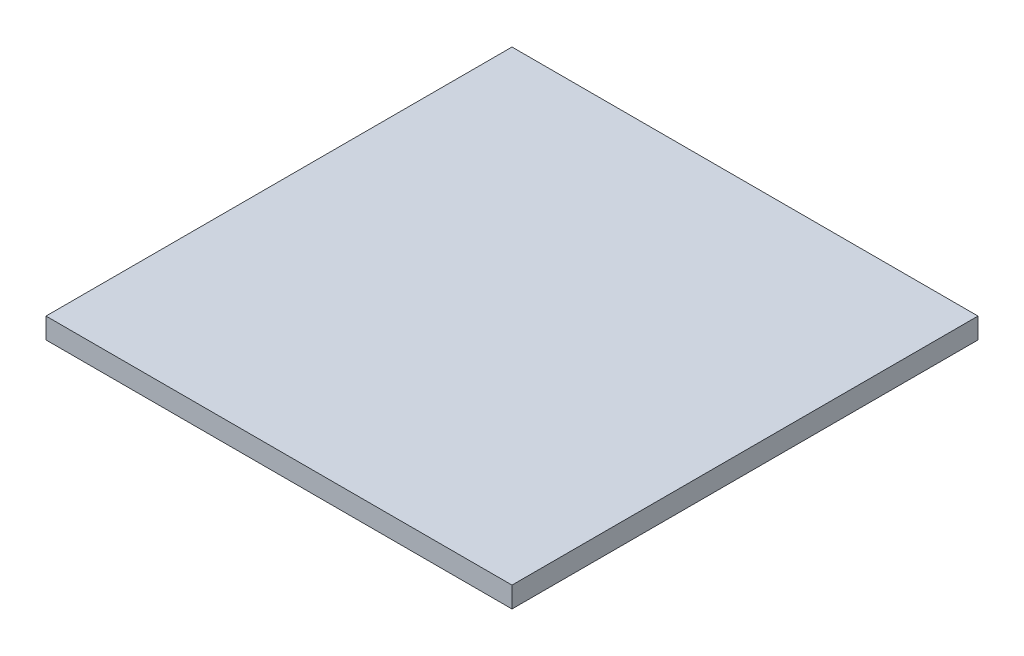
ISO-10303-21;
HEADER;
FILE_DESCRIPTION(('STEP AP214'),'2;1');
FILE_NAME('part.step','',(''),(''),'','','');
FILE_SCHEMA(('AUTOMOTIVE_DESIGN { 1 0 10303 214 1 1 1 1 }'));
ENDSEC;
DATA;
#1=APPLICATION_CONTEXT('core data for automotive mechanical design processes');
#2=APPLICATION_PROTOCOL_DEFINITION('international standard','automotive_design',2000,#1);
#3=PRODUCT_CONTEXT('',#1,'mechanical');
#4=PRODUCT('Part','Part','',(#3));
#5=PRODUCT_RELATED_PRODUCT_CATEGORY('part','',(#4));
#6=PRODUCT_DEFINITION_FORMATION('','',#4);
#7=PRODUCT_DEFINITION_CONTEXT('part definition',#1,'design');
#8=PRODUCT_DEFINITION('design','',#6,#7);
#9=PRODUCT_DEFINITION_SHAPE('','',#8);
#10=(LENGTH_UNIT() NAMED_UNIT(*) SI_UNIT(.MILLI.,.METRE.));
#11=(NAMED_UNIT(*) PLANE_ANGLE_UNIT() SI_UNIT($,.RADIAN.));
#12=(NAMED_UNIT(*) SI_UNIT($,.STERADIAN.) SOLID_ANGLE_UNIT());
#13=UNCERTAINTY_MEASURE_WITH_UNIT(LENGTH_MEASURE(1.E-05),#10,'distance_accuracy_value','');
#14=(GEOMETRIC_REPRESENTATION_CONTEXT(3) GLOBAL_UNCERTAINTY_ASSIGNED_CONTEXT((#13)) GLOBAL_UNIT_ASSIGNED_CONTEXT((#10,
#11,#12)) REPRESENTATION_CONTEXT('',''));
#15=CARTESIAN_POINT('',(0.,0.,0.));
#16=DIRECTION('',(0.,0.,1.));
#17=DIRECTION('',(1.,0.,0.));
#18=AXIS2_PLACEMENT_3D('',#15,#16,#17);
#19=CARTESIAN_POINT('',(0.,2.,0.));
#20=DIRECTION('',(1.,0.,0.));
#21=DIRECTION('',(0.,0.,-1.));
#22=AXIS2_PLACEMENT_3D('',#19,#20,#21);
#23=PLANE('',#22);
#24=DIRECTION('',(0.,0.,1.));
#25=VECTOR('',#24,1.);
#26=CARTESIAN_POINT('',(0.,0.,0.));
#27=LINE('',#26,#25);
#28=CARTESIAN_POINT('',(0.,0.,-45.));
#29=VERTEX_POINT('',#28);
#30=CARTESIAN_POINT('',(0.,0.,0.));
#31=VERTEX_POINT('',#30);
#32=EDGE_CURVE('E98',#29,#31,#27,.T.);
#33=ORIENTED_EDGE('',*,*,#32,.T.);
#34=DIRECTION('',(0.,-1.,0.));
#35=VECTOR('',#34,1.);
#36=CARTESIAN_POINT('',(0.,2.,0.));
#37=LINE('',#36,#35);
#38=CARTESIAN_POINT('',(0.,2.,0.));
#39=VERTEX_POINT('',#38);
#40=EDGE_CURVE('E11',#39,#31,#37,.T.);
#41=ORIENTED_EDGE('',*,*,#40,.F.);
#42=DIRECTION('',(0.,0.,1.));
#43=VECTOR('',#42,1.);
#44=CARTESIAN_POINT('',(0.,2.,0.));
#45=LINE('',#44,#43);
#46=CARTESIAN_POINT('',(0.,2.,-45.));
#47=VERTEX_POINT('',#46);
#48=EDGE_CURVE('E86',#47,#39,#45,.T.);
#49=ORIENTED_EDGE('',*,*,#48,.F.);
#50=DIRECTION('',(0.,-1.,0.));
#51=VECTOR('',#50,1.);
#52=CARTESIAN_POINT('',(0.,2.,-45.));
#53=LINE('',#52,#51);
#54=EDGE_CURVE('E94',#47,#29,#53,.T.);
#55=ORIENTED_EDGE('',*,*,#54,.T.);
#56=EDGE_LOOP('',(#33,#41,#49,#55));
#57=FACE_BOUND('',#56,.T.);
#58=ADVANCED_FACE('F35',(#57),#23,.F.);
#59=CARTESIAN_POINT('',(0.,2.,0.));
#60=DIRECTION('',(0.,0.,-1.));
#61=DIRECTION('',(-1.,0.,0.));
#62=AXIS2_PLACEMENT_3D('',#59,#60,#61);
#63=PLANE('',#62);
#64=DIRECTION('',(1.,0.,0.));
#65=VECTOR('',#64,1.);
#66=CARTESIAN_POINT('',(0.,0.,0.));
#67=LINE('',#66,#65);
#68=CARTESIAN_POINT('',(45.,0.,0.));
#69=VERTEX_POINT('',#68);
#70=EDGE_CURVE('E90',#31,#69,#67,.T.);
#71=ORIENTED_EDGE('',*,*,#70,.T.);
#72=DIRECTION('',(0.,-1.,0.));
#73=VECTOR('',#72,1.);
#74=CARTESIAN_POINT('',(45.,2.,0.));
#75=LINE('',#74,#73);
#76=CARTESIAN_POINT('',(45.,2.,0.));
#77=VERTEX_POINT('',#76);
#78=EDGE_CURVE('E43',#77,#69,#75,.T.);
#79=ORIENTED_EDGE('',*,*,#78,.F.);
#80=DIRECTION('',(1.,0.,0.));
#81=VECTOR('',#80,1.);
#82=CARTESIAN_POINT('',(0.,2.,0.));
#83=LINE('',#82,#81);
#84=EDGE_CURVE('E81',#39,#77,#83,.T.);
#85=ORIENTED_EDGE('',*,*,#84,.F.);
#86=ORIENTED_EDGE('',*,*,#40,.T.);
#87=EDGE_LOOP('',(#71,#79,#85,#86));
#88=FACE_BOUND('',#87,.T.);
#89=ADVANCED_FACE('F89',(#88),#63,.F.);
#90=CARTESIAN_POINT('',(45.,2.,0.));
#91=DIRECTION('',(-1.,0.,0.));
#92=DIRECTION('',(0.,0.,1.));
#93=AXIS2_PLACEMENT_3D('',#90,#91,#92);
#94=PLANE('',#93);
#95=DIRECTION('',(0.,0.,-1.));
#96=VECTOR('',#95,1.);
#97=CARTESIAN_POINT('',(45.,0.,0.));
#98=LINE('',#97,#96);
#99=CARTESIAN_POINT('',(45.,0.,-45.));
#100=VERTEX_POINT('',#99);
#101=EDGE_CURVE('E68',#69,#100,#98,.T.);
#102=ORIENTED_EDGE('',*,*,#101,.T.);
#103=DIRECTION('',(0.,-1.,0.));
#104=VECTOR('',#103,1.);
#105=CARTESIAN_POINT('',(45.,2.,-45.));
#106=LINE('',#105,#104);
#107=CARTESIAN_POINT('',(45.,2.,-45.));
#108=VERTEX_POINT('',#107);
#109=EDGE_CURVE('E91',#108,#100,#106,.T.);
#110=ORIENTED_EDGE('',*,*,#109,.F.);
#111=DIRECTION('',(0.,0.,-1.));
#112=VECTOR('',#111,1.);
#113=CARTESIAN_POINT('',(45.,2.,0.));
#114=LINE('',#113,#112);
#115=EDGE_CURVE('E84',#77,#108,#114,.T.);
#116=ORIENTED_EDGE('',*,*,#115,.F.);
#117=ORIENTED_EDGE('',*,*,#78,.T.);
#118=EDGE_LOOP('',(#102,#110,#116,#117));
#119=FACE_BOUND('',#118,.T.);
#120=ADVANCED_FACE('F92',(#119),#94,.F.);
#121=CARTESIAN_POINT('',(0.,2.,-45.));
#122=DIRECTION('',(0.,0.,1.));
#123=DIRECTION('',(1.,0.,0.));
#124=AXIS2_PLACEMENT_3D('',#121,#122,#123);
#125=PLANE('',#124);
#126=DIRECTION('',(-1.,0.,0.));
#127=VECTOR('',#126,1.);
#128=CARTESIAN_POINT('',(0.,0.,-45.));
#129=LINE('',#128,#127);
#130=EDGE_CURVE('E74',#100,#29,#129,.T.);
#131=ORIENTED_EDGE('',*,*,#130,.T.);
#132=ORIENTED_EDGE('',*,*,#54,.F.);
#133=DIRECTION('',(-1.,0.,0.));
#134=VECTOR('',#133,1.);
#135=CARTESIAN_POINT('',(0.,2.,-45.));
#136=LINE('',#135,#134);
#137=EDGE_CURVE('E51',#108,#47,#136,.T.);
#138=ORIENTED_EDGE('',*,*,#137,.F.);
#139=ORIENTED_EDGE('',*,*,#109,.T.);
#140=EDGE_LOOP('',(#131,#132,#138,#139));
#141=FACE_BOUND('',#140,.T.);
#142=ADVANCED_FACE('F105',(#141),#125,.F.);
#143=CARTESIAN_POINT('',(0.,2.,0.));
#144=DIRECTION('',(0.,-1.,0.));
#145=DIRECTION('',(0.,0.,-1.));
#146=AXIS2_PLACEMENT_3D('',#143,#144,#145);
#147=PLANE('',#146);
#148=ORIENTED_EDGE('',*,*,#48,.T.);
#149=ORIENTED_EDGE('',*,*,#84,.T.);
#150=ORIENTED_EDGE('',*,*,#115,.T.);
#151=ORIENTED_EDGE('',*,*,#137,.T.);
#152=EDGE_LOOP('',(#148,#149,#150,#151));
#153=FACE_BOUND('',#152,.T.);
#154=ADVANCED_FACE('F82',(#153),#147,.F.);
#155=CARTESIAN_POINT('',(0.,0.,0.));
#156=DIRECTION('',(0.,-1.,0.));
#157=DIRECTION('',(0.,0.,-1.));
#158=AXIS2_PLACEMENT_3D('',#155,#156,#157);
#159=PLANE('',#158);
#160=ORIENTED_EDGE('',*,*,#32,.F.);
#161=ORIENTED_EDGE('',*,*,#130,.F.);
#162=ORIENTED_EDGE('',*,*,#101,.F.);
#163=ORIENTED_EDGE('',*,*,#70,.F.);
#164=EDGE_LOOP('',(#160,#161,#162,#163));
#165=FACE_BOUND('',#164,.T.);
#166=ADVANCED_FACE('F108',(#165),#159,.T.);
#167=CLOSED_SHELL('',(#58,#89,#120,#142,#154,#166));
#168=MANIFOLD_SOLID_BREP('B2',#167);
#169=ADVANCED_BREP_SHAPE_REPRESENTATION('',(#18,#168),#14);
#170=SHAPE_DEFINITION_REPRESENTATION(#9,#169);
ENDSEC;
END-ISO-10303-21;
